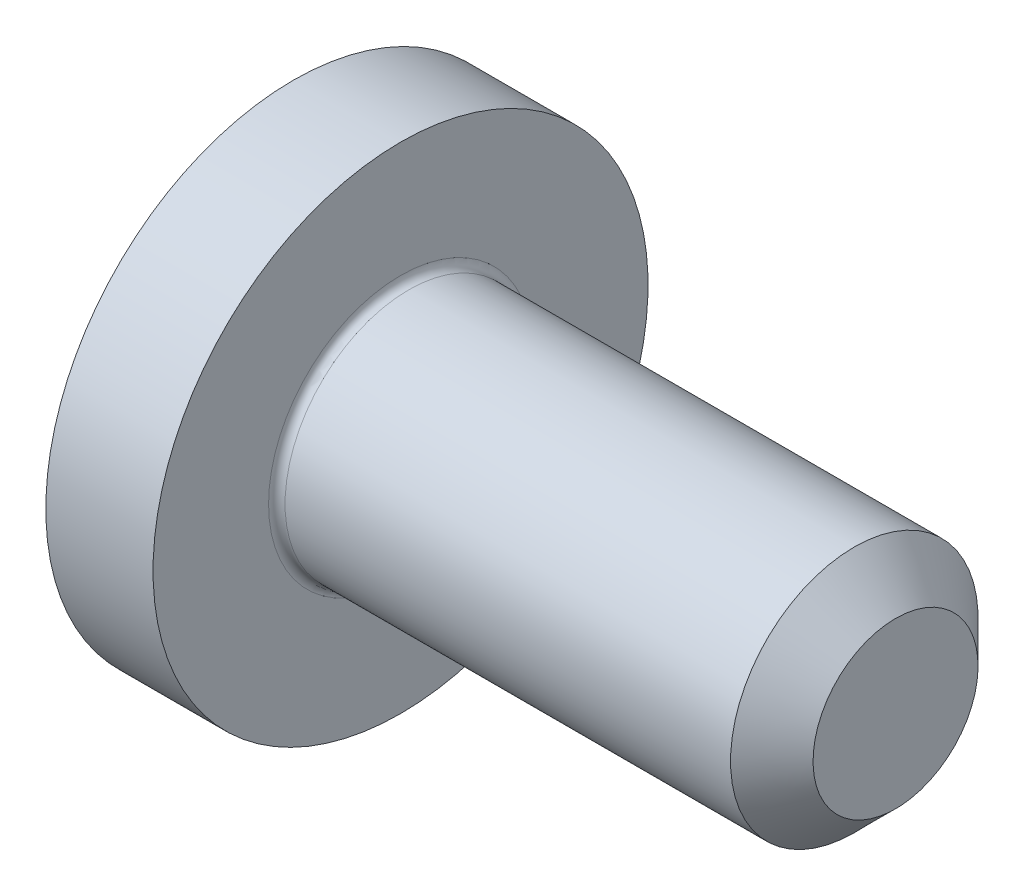
ISO-10303-21;
HEADER;
FILE_DESCRIPTION(('STEP AP214'),'2;1');
FILE_NAME('part.step','',(''),(''),'','','');
FILE_SCHEMA(('AUTOMOTIVE_DESIGN { 1 0 10303 214 1 1 1 1 }'));
ENDSEC;
DATA;
#1=APPLICATION_CONTEXT('core data for automotive mechanical design processes');
#2=APPLICATION_PROTOCOL_DEFINITION('international standard','automotive_design',2000,#1);
#3=PRODUCT_CONTEXT('',#1,'mechanical');
#4=PRODUCT('Part','Part','',(#3));
#5=PRODUCT_RELATED_PRODUCT_CATEGORY('part','',(#4));
#6=PRODUCT_DEFINITION_FORMATION('','',#4);
#7=PRODUCT_DEFINITION_CONTEXT('part definition',#1,'design');
#8=PRODUCT_DEFINITION('design','',#6,#7);
#9=PRODUCT_DEFINITION_SHAPE('','',#8);
#10=(LENGTH_UNIT() NAMED_UNIT(*) SI_UNIT(.MILLI.,.METRE.));
#11=(NAMED_UNIT(*) PLANE_ANGLE_UNIT() SI_UNIT($,.RADIAN.));
#12=(NAMED_UNIT(*) SI_UNIT($,.STERADIAN.) SOLID_ANGLE_UNIT());
#13=UNCERTAINTY_MEASURE_WITH_UNIT(LENGTH_MEASURE(1.E-05),#10,'distance_accuracy_value','');
#14=(GEOMETRIC_REPRESENTATION_CONTEXT(3) GLOBAL_UNCERTAINTY_ASSIGNED_CONTEXT((#13)) GLOBAL_UNIT_ASSIGNED_CONTEXT((#10,
#11,#12)) REPRESENTATION_CONTEXT('',''));
#15=CARTESIAN_POINT('',(0.,0.,0.));
#16=DIRECTION('',(0.,0.,1.));
#17=DIRECTION('',(1.,0.,0.));
#18=AXIS2_PLACEMENT_3D('',#15,#16,#17);
#19=CARTESIAN_POINT('',(-1.3,-3.,0.));
#20=DIRECTION('',(1.,0.,0.));
#21=DIRECTION('',(0.,1.,0.));
#22=AXIS2_PLACEMENT_3D('',#19,#20,#21);
#23=PLANE('',#22);
#24=DIRECTION('',(0.,-0.5,-0.866025403784439));
#25=VECTOR('',#24,1.);
#26=CARTESIAN_POINT('',(-1.3,0.866025403784439,0.));
#27=LINE('',#26,#25);
#28=CARTESIAN_POINT('',(-1.3,0.866025403784439,0.));
#29=VERTEX_POINT('',#28);
#30=CARTESIAN_POINT('',(-1.3,0.43301270189222,-0.75));
#31=VERTEX_POINT('',#30);
#32=EDGE_CURVE('E125',#29,#31,#27,.T.);
#33=ORIENTED_EDGE('',*,*,#32,.F.);
#34=DIRECTION('',(0.,0.5,-0.866025403784439));
#35=VECTOR('',#34,1.);
#36=CARTESIAN_POINT('',(-1.3,0.43301270189222,0.75));
#37=LINE('',#36,#35);
#38=CARTESIAN_POINT('',(-1.3,0.43301270189222,0.75));
#39=VERTEX_POINT('',#38);
#40=EDGE_CURVE('E51',#39,#29,#37,.T.);
#41=ORIENTED_EDGE('',*,*,#40,.F.);
#42=DIRECTION('',(0.,1.,0.));
#43=VECTOR('',#42,1.);
#44=CARTESIAN_POINT('',(-1.3,-0.43301270189222,0.75));
#45=LINE('',#44,#43);
#46=CARTESIAN_POINT('',(-1.3,-0.43301270189222,0.75));
#47=VERTEX_POINT('',#46);
#48=EDGE_CURVE('E134',#47,#39,#45,.T.);
#49=ORIENTED_EDGE('',*,*,#48,.F.);
#50=DIRECTION('',(0.,0.5,0.866025403784439));
#51=VECTOR('',#50,1.);
#52=CARTESIAN_POINT('',(-1.3,-0.866025403784439,0.));
#53=LINE('',#52,#51);
#54=CARTESIAN_POINT('',(-1.3,-0.866025403784439,0.));
#55=VERTEX_POINT('',#54);
#56=EDGE_CURVE('E132',#55,#47,#53,.T.);
#57=ORIENTED_EDGE('',*,*,#56,.F.);
#58=DIRECTION('',(0.,-0.5,0.866025403784438));
#59=VECTOR('',#58,1.);
#60=CARTESIAN_POINT('',(-1.3,-0.43301270189222,-0.75));
#61=LINE('',#60,#59);
#62=CARTESIAN_POINT('',(-1.3,-0.43301270189222,-0.75));
#63=VERTEX_POINT('',#62);
#64=EDGE_CURVE('E99',#63,#55,#61,.T.);
#65=ORIENTED_EDGE('',*,*,#64,.F.);
#66=DIRECTION('',(0.,-1.,0.));
#67=VECTOR('',#66,1.);
#68=CARTESIAN_POINT('',(-1.3,0.43301270189222,-0.75));
#69=LINE('',#68,#67);
#70=EDGE_CURVE('E128',#31,#63,#69,.T.);
#71=ORIENTED_EDGE('',*,*,#70,.F.);
#72=EDGE_LOOP('',(#33,#41,#49,#57,#65,#71));
#73=FACE_BOUND('',#72,.T.);
#74=CARTESIAN_POINT('',(-1.3,0.,0.));
#75=DIRECTION('',(1.,0.,0.));
#76=DIRECTION('',(0.,1.,0.));
#77=AXIS2_PLACEMENT_3D('',#74,#75,#76);
#78=CIRCLE('',#77,3.);
#79=CARTESIAN_POINT('',(-1.3,3.,0.));
#80=VERTEX_POINT('',#79);
#81=EDGE_CURVE('E11',#80,#80,#78,.T.);
#82=ORIENTED_EDGE('',*,*,#81,.F.);
#83=EDGE_LOOP('',(#82));
#84=FACE_BOUND('',#83,.T.);
#85=ADVANCED_FACE('F37',(#73,#84),#23,.F.);
#86=CARTESIAN_POINT('',(6.,0.,0.));
#87=DIRECTION('',(1.,0.,0.));
#88=DIRECTION('',(0.,1.,0.));
#89=AXIS2_PLACEMENT_3D('',#86,#87,#88);
#90=CYLINDRICAL_SURFACE('',#89,3.);
#91=CARTESIAN_POINT('',(0.,0.,0.));
#92=DIRECTION('',(1.,0.,0.));
#93=DIRECTION('',(0.,1.,0.));
#94=AXIS2_PLACEMENT_3D('',#91,#92,#93);
#95=CIRCLE('',#94,3.);
#96=CARTESIAN_POINT('',(0.,3.,0.));
#97=VERTEX_POINT('',#96);
#98=EDGE_CURVE('E44',#97,#97,#95,.T.);
#99=ORIENTED_EDGE('',*,*,#98,.F.);
#100=EDGE_LOOP('',(#99));
#101=FACE_BOUND('',#100,.T.);
#102=ORIENTED_EDGE('',*,*,#81,.T.);
#103=EDGE_LOOP('',(#102));
#104=FACE_BOUND('',#103,.T.);
#105=ADVANCED_FACE('F159',(#101,#104),#90,.T.);
#106=CARTESIAN_POINT('',(0.,-1.6,0.));
#107=DIRECTION('',(-1.,0.,0.));
#108=DIRECTION('',(0.,-1.,0.));
#109=AXIS2_PLACEMENT_3D('',#106,#107,#108);
#110=PLANE('',#109);
#111=CARTESIAN_POINT('',(0.,0.,0.));
#112=DIRECTION('',(1.,0.,0.));
#113=DIRECTION('',(0.,1.,0.));
#114=AXIS2_PLACEMENT_3D('',#111,#112,#113);
#115=CIRCLE('',#114,1.6);
#116=CARTESIAN_POINT('',(0.,1.6,0.));
#117=VERTEX_POINT('',#116);
#118=EDGE_CURVE('E152',#117,#117,#115,.T.);
#119=ORIENTED_EDGE('',*,*,#118,.F.);
#120=EDGE_LOOP('',(#119));
#121=FACE_BOUND('',#120,.T.);
#122=ORIENTED_EDGE('',*,*,#98,.T.);
#123=EDGE_LOOP('',(#122));
#124=FACE_BOUND('',#123,.T.);
#125=ADVANCED_FACE('F157',(#121,#124),#110,.F.);
#126=CARTESIAN_POINT('',(0.1,0.,0.));
#127=DIRECTION('',(1.,0.,0.));
#128=DIRECTION('',(0.,1.,0.));
#129=AXIS2_PLACEMENT_3D('',#126,#127,#128);
#130=TOROIDAL_SURFACE('',#129,1.6,0.1);
#131=CARTESIAN_POINT('',(0.1,0.,0.));
#132=DIRECTION('',(1.,0.,0.));
#133=DIRECTION('',(0.,1.,0.));
#134=AXIS2_PLACEMENT_3D('',#131,#132,#133);
#135=CIRCLE('',#134,1.5);
#136=CARTESIAN_POINT('',(0.1,1.5,0.));
#137=VERTEX_POINT('',#136);
#138=EDGE_CURVE('E149',#137,#137,#135,.T.);
#139=ORIENTED_EDGE('',*,*,#138,.F.);
#140=EDGE_LOOP('',(#139));
#141=FACE_BOUND('',#140,.T.);
#142=ORIENTED_EDGE('',*,*,#118,.T.);
#143=EDGE_LOOP('',(#142));
#144=FACE_BOUND('',#143,.T.);
#145=ADVANCED_FACE('F196',(#141,#144),#130,.F.);
#146=CARTESIAN_POINT('',(6.,0.,0.));
#147=DIRECTION('',(1.,0.,0.));
#148=DIRECTION('',(0.,1.,0.));
#149=AXIS2_PLACEMENT_3D('',#146,#147,#148);
#150=CYLINDRICAL_SURFACE('',#149,1.5);
#151=CARTESIAN_POINT('',(5.5,0.,0.));
#152=DIRECTION('',(1.,0.,0.));
#153=DIRECTION('',(0.,1.,0.));
#154=AXIS2_PLACEMENT_3D('',#151,#152,#153);
#155=CIRCLE('',#154,1.5);
#156=CARTESIAN_POINT('',(5.5,1.5,0.));
#157=VERTEX_POINT('',#156);
#158=EDGE_CURVE('E146',#157,#157,#155,.T.);
#159=ORIENTED_EDGE('',*,*,#158,.F.);
#160=EDGE_LOOP('',(#159));
#161=FACE_BOUND('',#160,.T.);
#162=ORIENTED_EDGE('',*,*,#138,.T.);
#163=EDGE_LOOP('',(#162));
#164=FACE_BOUND('',#163,.T.);
#165=ADVANCED_FACE('F192',(#161,#164),#150,.T.);
#166=CARTESIAN_POINT('',(5.5,0.,0.));
#167=DIRECTION('',(-1.,0.,0.));
#168=DIRECTION('',(0.,-1.,0.));
#169=AXIS2_PLACEMENT_3D('',#166,#167,#168);
#170=CONICAL_SURFACE('',#169,1.5,0.785398163397448);
#171=CARTESIAN_POINT('',(6.,0.,0.));
#172=DIRECTION('',(1.,0.,0.));
#173=DIRECTION('',(0.,1.,0.));
#174=AXIS2_PLACEMENT_3D('',#171,#172,#173);
#175=CIRCLE('',#174,0.999999999999999);
#176=CARTESIAN_POINT('',(6.,0.999999999999999,0.));
#177=VERTEX_POINT('',#176);
#178=EDGE_CURVE('E138',#177,#177,#175,.T.);
#179=ORIENTED_EDGE('',*,*,#178,.F.);
#180=EDGE_LOOP('',(#179));
#181=FACE_BOUND('',#180,.T.);
#182=ORIENTED_EDGE('',*,*,#158,.T.);
#183=EDGE_LOOP('',(#182));
#184=FACE_BOUND('',#183,.T.);
#185=ADVANCED_FACE('F184',(#181,#184),#170,.T.);
#186=CARTESIAN_POINT('',(6.,0.,0.));
#187=DIRECTION('',(-1.,0.,0.));
#188=DIRECTION('',(0.,-1.,0.));
#189=AXIS2_PLACEMENT_3D('',#186,#187,#188);
#190=PLANE('',#189);
#191=ORIENTED_EDGE('',*,*,#178,.T.);
#192=EDGE_LOOP('',(#191));
#193=FACE_BOUND('',#192,.T.);
#194=ADVANCED_FACE('F177',(#193),#190,.F.);
#195=CARTESIAN_POINT('',(0.7,0.43301270189222,0.75));
#196=DIRECTION('',(0.,0.866025403784439,0.5));
#197=DIRECTION('',(0.,-0.5,0.866025403784439));
#198=AXIS2_PLACEMENT_3D('',#195,#196,#197);
#199=PLANE('',#198);
#200=ORIENTED_EDGE('',*,*,#40,.T.);
#201=DIRECTION('',(-1.,0.,0.));
#202=VECTOR('',#201,1.);
#203=CARTESIAN_POINT('',(0.7,0.866025403784439,0.));
#204=LINE('',#203,#202);
#205=CARTESIAN_POINT('',(0.7,0.866025403784439,0.));
#206=VERTEX_POINT('',#205);
#207=EDGE_CURVE('E81',#206,#29,#204,.T.);
#208=ORIENTED_EDGE('',*,*,#207,.F.);
#209=DIRECTION('',(0.,0.5,-0.866025403784439));
#210=VECTOR('',#209,1.);
#211=CARTESIAN_POINT('',(0.7,0.43301270189222,0.75));
#212=LINE('',#211,#210);
#213=CARTESIAN_POINT('',(0.7,0.43301270189222,0.75));
#214=VERTEX_POINT('',#213);
#215=EDGE_CURVE('E136',#214,#206,#212,.T.);
#216=ORIENTED_EDGE('',*,*,#215,.F.);
#217=DIRECTION('',(-1.,0.,0.));
#218=VECTOR('',#217,1.);
#219=CARTESIAN_POINT('',(0.7,0.43301270189222,0.75));
#220=LINE('',#219,#218);
#221=EDGE_CURVE('E59',#214,#39,#220,.T.);
#222=ORIENTED_EDGE('',*,*,#221,.T.);
#223=EDGE_LOOP('',(#200,#208,#216,#222));
#224=FACE_BOUND('',#223,.T.);
#225=ADVANCED_FACE('F174',(#224),#199,.F.);
#226=CARTESIAN_POINT('',(0.7,-0.43301270189222,0.75));
#227=DIRECTION('',(0.,0.,1.));
#228=DIRECTION('',(1.,0.,0.));
#229=AXIS2_PLACEMENT_3D('',#226,#227,#228);
#230=PLANE('',#229);
#231=ORIENTED_EDGE('',*,*,#48,.T.);
#232=ORIENTED_EDGE('',*,*,#221,.F.);
#233=DIRECTION('',(0.,1.,0.));
#234=VECTOR('',#233,1.);
#235=CARTESIAN_POINT('',(0.7,-0.43301270189222,0.75));
#236=LINE('',#235,#234);
#237=CARTESIAN_POINT('',(0.7,-0.43301270189222,0.75));
#238=VERTEX_POINT('',#237);
#239=EDGE_CURVE('E111',#238,#214,#236,.T.);
#240=ORIENTED_EDGE('',*,*,#239,.F.);
#241=DIRECTION('',(-1.,0.,0.));
#242=VECTOR('',#241,1.);
#243=CARTESIAN_POINT('',(0.7,-0.43301270189222,0.75));
#244=LINE('',#243,#242);
#245=EDGE_CURVE('E103',#238,#47,#244,.T.);
#246=ORIENTED_EDGE('',*,*,#245,.T.);
#247=EDGE_LOOP('',(#231,#232,#240,#246));
#248=FACE_BOUND('',#247,.T.);
#249=ADVANCED_FACE('F176',(#248),#230,.F.);
#250=CARTESIAN_POINT('',(0.7,-0.866025403784439,0.));
#251=DIRECTION('',(0.,-0.866025403784439,0.5));
#252=DIRECTION('',(0.,-0.5,-0.866025403784439));
#253=AXIS2_PLACEMENT_3D('',#250,#251,#252);
#254=PLANE('',#253);
#255=ORIENTED_EDGE('',*,*,#56,.T.);
#256=ORIENTED_EDGE('',*,*,#245,.F.);
#257=DIRECTION('',(0.,0.5,0.866025403784439));
#258=VECTOR('',#257,1.);
#259=CARTESIAN_POINT('',(0.7,-0.866025403784439,0.));
#260=LINE('',#259,#258);
#261=CARTESIAN_POINT('',(0.7,-0.866025403784439,0.));
#262=VERTEX_POINT('',#261);
#263=EDGE_CURVE('E107',#262,#238,#260,.T.);
#264=ORIENTED_EDGE('',*,*,#263,.F.);
#265=DIRECTION('',(-1.,0.,0.));
#266=VECTOR('',#265,1.);
#267=CARTESIAN_POINT('',(0.7,-0.866025403784439,0.));
#268=LINE('',#267,#266);
#269=EDGE_CURVE('E92',#262,#55,#268,.T.);
#270=ORIENTED_EDGE('',*,*,#269,.T.);
#271=EDGE_LOOP('',(#255,#256,#264,#270));
#272=FACE_BOUND('',#271,.T.);
#273=ADVANCED_FACE('F108',(#272),#254,.F.);
#274=CARTESIAN_POINT('',(0.7,-0.433012701892219,-0.75));
#275=DIRECTION('',(0.,-0.866025403784439,-0.5));
#276=DIRECTION('',(0.,0.5,-0.866025403784438));
#277=AXIS2_PLACEMENT_3D('',#274,#275,#276);
#278=PLANE('',#277);
#279=ORIENTED_EDGE('',*,*,#64,.T.);
#280=ORIENTED_EDGE('',*,*,#269,.F.);
#281=DIRECTION('',(0.,-0.5,0.866025403784438));
#282=VECTOR('',#281,1.);
#283=CARTESIAN_POINT('',(0.7,-0.433012701892219,-0.75));
#284=LINE('',#283,#282);
#285=CARTESIAN_POINT('',(0.7,-0.433012701892219,-0.75));
#286=VERTEX_POINT('',#285);
#287=EDGE_CURVE('E96',#286,#262,#284,.T.);
#288=ORIENTED_EDGE('',*,*,#287,.F.);
#289=DIRECTION('',(-1.,0.,0.));
#290=VECTOR('',#289,1.);
#291=CARTESIAN_POINT('',(0.7,-0.433012701892219,-0.75));
#292=LINE('',#291,#290);
#293=EDGE_CURVE('E104',#286,#63,#292,.T.);
#294=ORIENTED_EDGE('',*,*,#293,.T.);
#295=EDGE_LOOP('',(#279,#280,#288,#294));
#296=FACE_BOUND('',#295,.T.);
#297=ADVANCED_FACE('F94',(#296),#278,.F.);
#298=CARTESIAN_POINT('',(0.7,0.43301270189222,-0.75));
#299=DIRECTION('',(0.,0.,-1.));
#300=DIRECTION('',(-1.,0.,0.));
#301=AXIS2_PLACEMENT_3D('',#298,#299,#300);
#302=PLANE('',#301);
#303=ORIENTED_EDGE('',*,*,#70,.T.);
#304=ORIENTED_EDGE('',*,*,#293,.F.);
#305=DIRECTION('',(0.,-1.,0.));
#306=VECTOR('',#305,1.);
#307=CARTESIAN_POINT('',(0.7,0.43301270189222,-0.75));
#308=LINE('',#307,#306);
#309=CARTESIAN_POINT('',(0.7,0.43301270189222,-0.75));
#310=VERTEX_POINT('',#309);
#311=EDGE_CURVE('E117',#310,#286,#308,.T.);
#312=ORIENTED_EDGE('',*,*,#311,.F.);
#313=DIRECTION('',(-1.,0.,0.));
#314=VECTOR('',#313,1.);
#315=CARTESIAN_POINT('',(0.7,0.43301270189222,-0.75));
#316=LINE('',#315,#314);
#317=EDGE_CURVE('E141',#310,#31,#316,.T.);
#318=ORIENTED_EDGE('',*,*,#317,.T.);
#319=EDGE_LOOP('',(#303,#304,#312,#318));
#320=FACE_BOUND('',#319,.T.);
#321=ADVANCED_FACE('F258',(#320),#302,.F.);
#322=CARTESIAN_POINT('',(0.7,0.866025403784439,0.));
#323=DIRECTION('',(0.,0.866025403784439,-0.5));
#324=DIRECTION('',(0.,0.5,0.866025403784439));
#325=AXIS2_PLACEMENT_3D('',#322,#323,#324);
#326=PLANE('',#325);
#327=ORIENTED_EDGE('',*,*,#32,.T.);
#328=ORIENTED_EDGE('',*,*,#317,.F.);
#329=DIRECTION('',(0.,-0.5,-0.866025403784439));
#330=VECTOR('',#329,1.);
#331=CARTESIAN_POINT('',(0.7,0.866025403784439,0.));
#332=LINE('',#331,#330);
#333=EDGE_CURVE('E119',#206,#310,#332,.T.);
#334=ORIENTED_EDGE('',*,*,#333,.F.);
#335=ORIENTED_EDGE('',*,*,#207,.T.);
#336=EDGE_LOOP('',(#327,#328,#334,#335));
#337=FACE_BOUND('',#336,.T.);
#338=ADVANCED_FACE('F172',(#337),#326,.F.);
#339=CARTESIAN_POINT('',(0.7,0.,0.));
#340=DIRECTION('',(-1.,0.,0.));
#341=DIRECTION('',(0.,0.,1.));
#342=AXIS2_PLACEMENT_3D('',#339,#340,#341);
#343=PLANE('',#342);
#344=ORIENTED_EDGE('',*,*,#215,.T.);
#345=ORIENTED_EDGE('',*,*,#333,.T.);
#346=ORIENTED_EDGE('',*,*,#311,.T.);
#347=ORIENTED_EDGE('',*,*,#287,.T.);
#348=ORIENTED_EDGE('',*,*,#263,.T.);
#349=ORIENTED_EDGE('',*,*,#239,.T.);
#350=EDGE_LOOP('',(#344,#345,#346,#347,#348,#349));
#351=FACE_BOUND('',#350,.T.);
#352=ADVANCED_FACE('F114',(#351),#343,.T.);
#353=CLOSED_SHELL('',(#85,#105,#125,#145,#165,#185,#194,#225,#249,#273,#297,#321,#338,#352));
#354=MANIFOLD_SOLID_BREP('B2',#353);
#355=ADVANCED_BREP_SHAPE_REPRESENTATION('',(#18,#354),#14);
#356=SHAPE_DEFINITION_REPRESENTATION(#9,#355);
ENDSEC;
END-ISO-10303-21;
